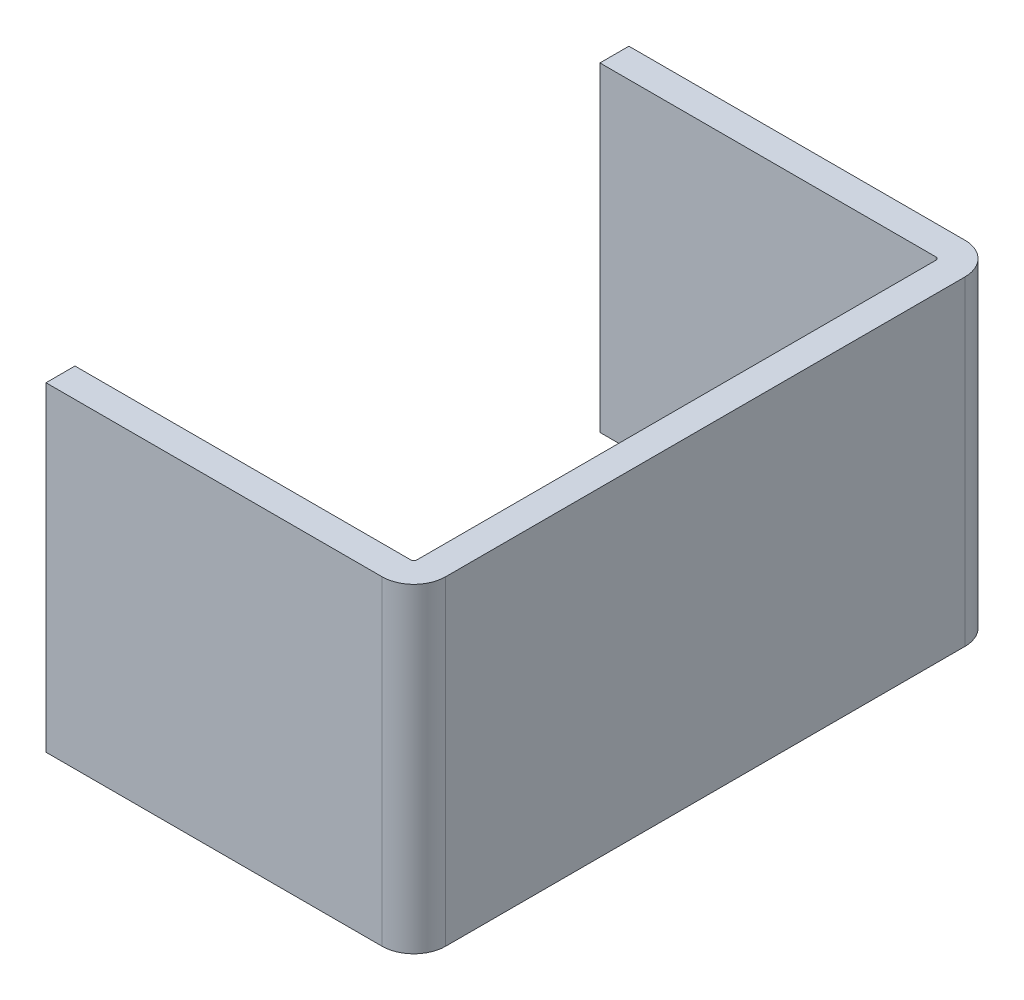
ISO-10303-21;
HEADER;
FILE_DESCRIPTION(('STEP AP214'),'2;1');
FILE_NAME('part.step','',(''),(''),'','','');
FILE_SCHEMA(('AUTOMOTIVE_DESIGN { 1 0 10303 214 1 1 1 1 }'));
ENDSEC;
DATA;
#1=APPLICATION_CONTEXT('core data for automotive mechanical design processes');
#2=APPLICATION_PROTOCOL_DEFINITION('international standard','automotive_design',2000,#1);
#3=PRODUCT_CONTEXT('',#1,'mechanical');
#4=PRODUCT('Part','Part','',(#3));
#5=PRODUCT_RELATED_PRODUCT_CATEGORY('part','',(#4));
#6=PRODUCT_DEFINITION_FORMATION('','',#4);
#7=PRODUCT_DEFINITION_CONTEXT('part definition',#1,'design');
#8=PRODUCT_DEFINITION('design','',#6,#7);
#9=PRODUCT_DEFINITION_SHAPE('','',#8);
#10=(LENGTH_UNIT() NAMED_UNIT(*) SI_UNIT(.MILLI.,.METRE.));
#11=(NAMED_UNIT(*) PLANE_ANGLE_UNIT() SI_UNIT($,.RADIAN.));
#12=(NAMED_UNIT(*) SI_UNIT($,.STERADIAN.) SOLID_ANGLE_UNIT());
#13=UNCERTAINTY_MEASURE_WITH_UNIT(LENGTH_MEASURE(1.E-05),#10,'distance_accuracy_value','');
#14=(GEOMETRIC_REPRESENTATION_CONTEXT(3) GLOBAL_UNCERTAINTY_ASSIGNED_CONTEXT((#13)) GLOBAL_UNIT_ASSIGNED_CONTEXT((#10,
#11,#12)) REPRESENTATION_CONTEXT('',''));
#15=CARTESIAN_POINT('',(0.,0.,0.));
#16=DIRECTION('',(0.,0.,1.));
#17=DIRECTION('',(1.,0.,0.));
#18=AXIS2_PLACEMENT_3D('',#15,#16,#17);
#19=CARTESIAN_POINT('',(0.,1.1049,4.025));
#20=DIRECTION('',(0.,0.,-1.));
#21=DIRECTION('',(-1.,0.,0.));
#22=AXIS2_PLACEMENT_3D('',#19,#20,#21);
#23=PLANE('',#22);
#24=DIRECTION('',(1.,0.,0.));
#25=VECTOR('',#24,1.);
#26=CARTESIAN_POINT('',(0.,1.1049,4.025));
#27=LINE('',#26,#25);
#28=CARTESIAN_POINT('',(2.32,1.1049,4.025));
#29=VERTEX_POINT('',#28);
#30=CARTESIAN_POINT('',(0.,1.1049,4.025));
#31=VERTEX_POINT('',#30);
#32=EDGE_CURVE('E187',#29,#31,#27,.F.);
#33=ORIENTED_EDGE('',*,*,#32,.T.);
#34=DIRECTION('',(0.,1.,0.));
#35=VECTOR('',#34,1.);
#36=CARTESIAN_POINT('',(0.,-1.1049,4.025));
#37=LINE('',#36,#35);
#38=CARTESIAN_POINT('',(0.,-1.1049,4.025));
#39=VERTEX_POINT('',#38);
#40=EDGE_CURVE('E184',#39,#31,#37,.T.);
#41=ORIENTED_EDGE('',*,*,#40,.F.);
#42=DIRECTION('',(1.,0.,0.));
#43=VECTOR('',#42,1.);
#44=CARTESIAN_POINT('',(0.,-1.1049,4.025));
#45=LINE('',#44,#43);
#46=CARTESIAN_POINT('',(2.32,-1.1049,4.025));
#47=VERTEX_POINT('',#46);
#48=EDGE_CURVE('E171',#39,#47,#45,.T.);
#49=ORIENTED_EDGE('',*,*,#48,.T.);
#50=DIRECTION('',(0.,1.,0.));
#51=VECTOR('',#50,1.);
#52=CARTESIAN_POINT('',(2.32,1.1049,4.025));
#53=LINE('',#52,#51);
#54=EDGE_CURVE('E98',#29,#47,#53,.F.);
#55=ORIENTED_EDGE('',*,*,#54,.F.);
#56=EDGE_LOOP('',(#33,#41,#49,#55));
#57=FACE_BOUND('',#56,.T.);
#58=ADVANCED_FACE('F17',(#57),#23,.F.);
#59=CARTESIAN_POINT('',(2.32,1.1049,0.));
#60=DIRECTION('',(0.,0.,1.));
#61=DIRECTION('',(1.,0.,0.));
#62=AXIS2_PLACEMENT_3D('',#59,#60,#61);
#63=PLANE('',#62);
#64=DIRECTION('',(1.,0.,0.));
#65=VECTOR('',#64,1.);
#66=CARTESIAN_POINT('',(2.32,1.1049,0.));
#67=LINE('',#66,#65);
#68=CARTESIAN_POINT('',(0.,1.1049,0.));
#69=VERTEX_POINT('',#68);
#70=CARTESIAN_POINT('',(2.32,1.1049,0.));
#71=VERTEX_POINT('',#70);
#72=EDGE_CURVE('E162',#69,#71,#67,.T.);
#73=ORIENTED_EDGE('',*,*,#72,.T.);
#74=DIRECTION('',(0.,1.,0.));
#75=VECTOR('',#74,1.);
#76=CARTESIAN_POINT('',(2.32,1.1049,0.));
#77=LINE('',#76,#75);
#78=CARTESIAN_POINT('',(2.32,-1.1049,0.));
#79=VERTEX_POINT('',#78);
#80=EDGE_CURVE('E97',#79,#71,#77,.T.);
#81=ORIENTED_EDGE('',*,*,#80,.F.);
#82=DIRECTION('',(1.,0.,0.));
#83=VECTOR('',#82,1.);
#84=CARTESIAN_POINT('',(2.32,-1.1049,0.));
#85=LINE('',#84,#83);
#86=CARTESIAN_POINT('',(0.,-1.1049,0.));
#87=VERTEX_POINT('',#86);
#88=EDGE_CURVE('E94',#79,#87,#85,.F.);
#89=ORIENTED_EDGE('',*,*,#88,.T.);
#90=DIRECTION('',(0.,1.,0.));
#91=VECTOR('',#90,1.);
#92=CARTESIAN_POINT('',(0.,-1.1049,0.));
#93=LINE('',#92,#91);
#94=EDGE_CURVE('E153',#87,#69,#93,.T.);
#95=ORIENTED_EDGE('',*,*,#94,.T.);
#96=EDGE_LOOP('',(#73,#81,#89,#95));
#97=FACE_BOUND('',#96,.T.);
#98=ADVANCED_FACE('F267',(#97),#63,.F.);
#99=CARTESIAN_POINT('',(0.,-1.1049,3.825));
#100=DIRECTION('',(-1.,0.,0.));
#101=DIRECTION('',(0.,0.,1.));
#102=AXIS2_PLACEMENT_3D('',#99,#100,#101);
#103=PLANE('',#102);
#104=DIRECTION('',(0.,0.,1.));
#105=VECTOR('',#104,1.);
#106=CARTESIAN_POINT('',(0.,1.1049,3.825));
#107=LINE('',#106,#105);
#108=CARTESIAN_POINT('',(0.,1.1049,3.825));
#109=VERTEX_POINT('',#108);
#110=EDGE_CURVE('E175',#31,#109,#107,.F.);
#111=ORIENTED_EDGE('',*,*,#110,.T.);
#112=DIRECTION('',(0.,1.,0.));
#113=VECTOR('',#112,1.);
#114=CARTESIAN_POINT('',(0.,-1.1049,3.825));
#115=LINE('',#114,#113);
#116=CARTESIAN_POINT('',(0.,-1.1049,3.825));
#117=VERTEX_POINT('',#116);
#118=EDGE_CURVE('E134',#109,#117,#115,.F.);
#119=ORIENTED_EDGE('',*,*,#118,.T.);
#120=DIRECTION('',(0.,0.,1.));
#121=VECTOR('',#120,1.);
#122=CARTESIAN_POINT('',(0.,-1.1049,4.025));
#123=LINE('',#122,#121);
#124=EDGE_CURVE('E172',#117,#39,#123,.T.);
#125=ORIENTED_EDGE('',*,*,#124,.T.);
#126=ORIENTED_EDGE('',*,*,#40,.T.);
#127=EDGE_LOOP('',(#111,#119,#125,#126));
#128=FACE_BOUND('',#127,.T.);
#129=ADVANCED_FACE('F225',(#128),#103,.T.);
#130=CARTESIAN_POINT('',(2.32,1.1049,3.805));
#131=DIRECTION('',(0.,1.,0.));
#132=DIRECTION('',(0.,0.,1.));
#133=AXIS2_PLACEMENT_3D('',#130,#131,#132);
#134=CYLINDRICAL_SURFACE('',#133,0.22);
#135=CARTESIAN_POINT('',(2.32,1.1049,3.805));
#136=DIRECTION('',(0.,1.,0.));
#137=DIRECTION('',(0.,0.,1.));
#138=AXIS2_PLACEMENT_3D('',#135,#136,#137);
#139=CIRCLE('',#138,0.22);
#140=CARTESIAN_POINT('',(2.54,1.1049,3.805));
#141=VERTEX_POINT('',#140);
#142=EDGE_CURVE('E140',#29,#141,#139,.T.);
#143=ORIENTED_EDGE('',*,*,#142,.F.);
#144=ORIENTED_EDGE('',*,*,#54,.T.);
#145=CARTESIAN_POINT('',(2.32,-1.1049,3.805));
#146=DIRECTION('',(0.,1.,0.));
#147=DIRECTION('',(0.,0.,1.));
#148=AXIS2_PLACEMENT_3D('',#145,#146,#147);
#149=CIRCLE('',#148,0.22);
#150=CARTESIAN_POINT('',(2.54,-1.1049,3.805));
#151=VERTEX_POINT('',#150);
#152=EDGE_CURVE('E125',#151,#47,#149,.F.);
#153=ORIENTED_EDGE('',*,*,#152,.F.);
#154=DIRECTION('',(0.,1.,0.));
#155=VECTOR('',#154,1.);
#156=CARTESIAN_POINT('',(2.54,1.1049,3.805));
#157=LINE('',#156,#155);
#158=EDGE_CURVE('E108',#151,#141,#157,.T.);
#159=ORIENTED_EDGE('',*,*,#158,.T.);
#160=EDGE_LOOP('',(#143,#144,#153,#159));
#161=FACE_BOUND('',#160,.T.);
#162=ADVANCED_FACE('F217',(#161),#134,.T.);
#163=CARTESIAN_POINT('',(2.32,1.1049,0.22));
#164=DIRECTION('',(0.,1.,0.));
#165=DIRECTION('',(0.,0.,1.));
#166=AXIS2_PLACEMENT_3D('',#163,#164,#165);
#167=CYLINDRICAL_SURFACE('',#166,0.22);
#168=CARTESIAN_POINT('',(2.32,1.1049,0.22));
#169=DIRECTION('',(0.,1.,0.));
#170=DIRECTION('',(0.,0.,1.));
#171=AXIS2_PLACEMENT_3D('',#168,#169,#170);
#172=CIRCLE('',#171,0.22);
#173=CARTESIAN_POINT('',(2.54,1.1049,0.22));
#174=VERTEX_POINT('',#173);
#175=EDGE_CURVE('E103',#71,#174,#172,.F.);
#176=ORIENTED_EDGE('',*,*,#175,.T.);
#177=DIRECTION('',(0.,1.,0.));
#178=VECTOR('',#177,1.);
#179=CARTESIAN_POINT('',(2.54,1.1049,0.22));
#180=LINE('',#179,#178);
#181=CARTESIAN_POINT('',(2.54,-1.1049,0.22));
#182=VERTEX_POINT('',#181);
#183=EDGE_CURVE('E100',#174,#182,#180,.F.);
#184=ORIENTED_EDGE('',*,*,#183,.T.);
#185=CARTESIAN_POINT('',(2.32,-1.1049,0.22));
#186=DIRECTION('',(0.,1.,0.));
#187=DIRECTION('',(0.,0.,1.));
#188=AXIS2_PLACEMENT_3D('',#185,#186,#187);
#189=CIRCLE('',#188,0.22);
#190=EDGE_CURVE('E20',#182,#79,#189,.T.);
#191=ORIENTED_EDGE('',*,*,#190,.T.);
#192=ORIENTED_EDGE('',*,*,#80,.T.);
#193=EDGE_LOOP('',(#176,#184,#191,#192));
#194=FACE_BOUND('',#193,.T.);
#195=ADVANCED_FACE('F101',(#194),#167,.T.);
#196=CARTESIAN_POINT('',(0.,-1.1049,0.2));
#197=DIRECTION('',(1.,0.,0.));
#198=DIRECTION('',(0.,0.,-1.));
#199=AXIS2_PLACEMENT_3D('',#196,#197,#198);
#200=PLANE('',#199);
#201=DIRECTION('',(0.,0.,-1.));
#202=VECTOR('',#201,1.);
#203=CARTESIAN_POINT('',(0.,1.1049,0.2));
#204=LINE('',#203,#202);
#205=CARTESIAN_POINT('',(0.,1.1049,0.2));
#206=VERTEX_POINT('',#205);
#207=EDGE_CURVE('E156',#69,#206,#204,.F.);
#208=ORIENTED_EDGE('',*,*,#207,.F.);
#209=ORIENTED_EDGE('',*,*,#94,.F.);
#210=DIRECTION('',(0.,0.,-1.));
#211=VECTOR('',#210,1.);
#212=CARTESIAN_POINT('',(0.,-1.1049,0.2));
#213=LINE('',#212,#211);
#214=CARTESIAN_POINT('',(0.,-1.1049,0.2));
#215=VERTEX_POINT('',#214);
#216=EDGE_CURVE('E151',#215,#87,#213,.T.);
#217=ORIENTED_EDGE('',*,*,#216,.F.);
#218=DIRECTION('',(0.,1.,0.));
#219=VECTOR('',#218,1.);
#220=CARTESIAN_POINT('',(0.,-1.1049,0.2));
#221=LINE('',#220,#219);
#222=EDGE_CURVE('E145',#215,#206,#221,.T.);
#223=ORIENTED_EDGE('',*,*,#222,.T.);
#224=EDGE_LOOP('',(#208,#209,#217,#223));
#225=FACE_BOUND('',#224,.T.);
#226=ADVANCED_FACE('F266',(#225),#200,.F.);
#227=CARTESIAN_POINT('',(0.,-1.1049,3.825));
#228=DIRECTION('',(0.,0.,1.));
#229=DIRECTION('',(1.,0.,0.));
#230=AXIS2_PLACEMENT_3D('',#227,#228,#229);
#231=PLANE('',#230);
#232=DIRECTION('',(1.,0.,0.));
#233=VECTOR('',#232,1.);
#234=CARTESIAN_POINT('',(0.,-1.1049,3.825));
#235=LINE('',#234,#233);
#236=CARTESIAN_POINT('',(2.32,-1.1049,3.825));
#237=VERTEX_POINT('',#236);
#238=EDGE_CURVE('E132',#117,#237,#235,.T.);
#239=ORIENTED_EDGE('',*,*,#238,.F.);
#240=ORIENTED_EDGE('',*,*,#118,.F.);
#241=DIRECTION('',(1.,0.,0.));
#242=VECTOR('',#241,1.);
#243=CARTESIAN_POINT('',(0.,1.1049,3.825));
#244=LINE('',#243,#242);
#245=CARTESIAN_POINT('',(2.32,1.1049,3.825));
#246=VERTEX_POINT('',#245);
#247=EDGE_CURVE('E137',#246,#109,#244,.F.);
#248=ORIENTED_EDGE('',*,*,#247,.F.);
#249=DIRECTION('',(0.,1.,0.));
#250=VECTOR('',#249,1.);
#251=CARTESIAN_POINT('',(2.32,-1.1049,3.825));
#252=LINE('',#251,#250);
#253=EDGE_CURVE('E118',#246,#237,#252,.F.);
#254=ORIENTED_EDGE('',*,*,#253,.T.);
#255=EDGE_LOOP('',(#239,#240,#248,#254));
#256=FACE_BOUND('',#255,.T.);
#257=ADVANCED_FACE('F230',(#256),#231,.F.);
#258=CARTESIAN_POINT('',(2.54,1.1049,3.805));
#259=DIRECTION('',(-1.,0.,0.));
#260=DIRECTION('',(0.,0.,1.));
#261=AXIS2_PLACEMENT_3D('',#258,#259,#260);
#262=PLANE('',#261);
#263=DIRECTION('',(0.,0.,-1.));
#264=VECTOR('',#263,1.);
#265=CARTESIAN_POINT('',(2.54,1.1049,3.805));
#266=LINE('',#265,#264);
#267=EDGE_CURVE('E143',#174,#141,#266,.F.);
#268=ORIENTED_EDGE('',*,*,#267,.T.);
#269=ORIENTED_EDGE('',*,*,#158,.F.);
#270=DIRECTION('',(0.,0.,1.));
#271=VECTOR('',#270,1.);
#272=CARTESIAN_POINT('',(2.54,-1.1049,3.805));
#273=LINE('',#272,#271);
#274=EDGE_CURVE('E91',#151,#182,#273,.F.);
#275=ORIENTED_EDGE('',*,*,#274,.T.);
#276=ORIENTED_EDGE('',*,*,#183,.F.);
#277=EDGE_LOOP('',(#268,#269,#275,#276));
#278=FACE_BOUND('',#277,.T.);
#279=ADVANCED_FACE('F110',(#278),#262,.F.);
#280=CARTESIAN_POINT('',(2.32,-1.1049,0.2));
#281=DIRECTION('',(0.,0.,-1.));
#282=DIRECTION('',(-1.,0.,0.));
#283=AXIS2_PLACEMENT_3D('',#280,#281,#282);
#284=PLANE('',#283);
#285=DIRECTION('',(-1.,0.,0.));
#286=VECTOR('',#285,1.);
#287=CARTESIAN_POINT('',(2.32,-1.1049,0.2));
#288=LINE('',#287,#286);
#289=CARTESIAN_POINT('',(2.32,-1.1049,0.2));
#290=VERTEX_POINT('',#289);
#291=EDGE_CURVE('E148',#290,#215,#288,.T.);
#292=ORIENTED_EDGE('',*,*,#291,.F.);
#293=DIRECTION('',(0.,1.,0.));
#294=VECTOR('',#293,1.);
#295=CARTESIAN_POINT('',(2.32,-1.1049,0.2));
#296=LINE('',#295,#294);
#297=CARTESIAN_POINT('',(2.32,1.1049,0.2));
#298=VERTEX_POINT('',#297);
#299=EDGE_CURVE('E205',#290,#298,#296,.T.);
#300=ORIENTED_EDGE('',*,*,#299,.T.);
#301=DIRECTION('',(-1.,0.,0.));
#302=VECTOR('',#301,1.);
#303=CARTESIAN_POINT('',(2.32,1.1049,0.2));
#304=LINE('',#303,#302);
#305=EDGE_CURVE('E107',#206,#298,#304,.F.);
#306=ORIENTED_EDGE('',*,*,#305,.F.);
#307=ORIENTED_EDGE('',*,*,#222,.F.);
#308=EDGE_LOOP('',(#292,#300,#306,#307));
#309=FACE_BOUND('',#308,.T.);
#310=ADVANCED_FACE('F256',(#309),#284,.F.);
#311=CARTESIAN_POINT('',(2.34,1.1049,3.805));
#312=DIRECTION('',(0.,-1.,0.));
#313=DIRECTION('',(0.,0.,-1.));
#314=AXIS2_PLACEMENT_3D('',#311,#312,#313);
#315=PLANE('',#314);
#316=DIRECTION('',(0.,0.,-1.));
#317=VECTOR('',#316,1.);
#318=CARTESIAN_POINT('',(2.34,1.1049,3.805));
#319=LINE('',#318,#317);
#320=CARTESIAN_POINT('',(2.34,1.1049,0.22));
#321=VERTEX_POINT('',#320);
#322=CARTESIAN_POINT('',(2.34,1.1049,3.805));
#323=VERTEX_POINT('',#322);
#324=EDGE_CURVE('E121',#321,#323,#319,.F.);
#325=ORIENTED_EDGE('',*,*,#324,.T.);
#326=CARTESIAN_POINT('',(2.32,1.1049,3.805));
#327=DIRECTION('',(0.,1.,0.));
#328=DIRECTION('',(0.,0.,1.));
#329=AXIS2_PLACEMENT_3D('',#326,#327,#328);
#330=CIRCLE('',#329,0.02);
#331=EDGE_CURVE('E131',#323,#246,#330,.F.);
#332=ORIENTED_EDGE('',*,*,#331,.T.);
#333=ORIENTED_EDGE('',*,*,#247,.T.);
#334=ORIENTED_EDGE('',*,*,#110,.F.);
#335=ORIENTED_EDGE('',*,*,#32,.F.);
#336=ORIENTED_EDGE('',*,*,#142,.T.);
#337=ORIENTED_EDGE('',*,*,#267,.F.);
#338=ORIENTED_EDGE('',*,*,#175,.F.);
#339=ORIENTED_EDGE('',*,*,#72,.F.);
#340=ORIENTED_EDGE('',*,*,#207,.T.);
#341=ORIENTED_EDGE('',*,*,#305,.T.);
#342=CARTESIAN_POINT('',(2.32,1.1049,0.22));
#343=DIRECTION('',(0.,1.,0.));
#344=DIRECTION('',(0.,0.,1.));
#345=AXIS2_PLACEMENT_3D('',#342,#343,#344);
#346=CIRCLE('',#345,0.02);
#347=EDGE_CURVE('E113',#298,#321,#346,.F.);
#348=ORIENTED_EDGE('',*,*,#347,.T.);
#349=EDGE_LOOP('',(#325,#332,#333,#334,#335,#336,#337,#338,#339,#340,#341,#348));
#350=FACE_BOUND('',#349,.T.);
#351=ADVANCED_FACE('F213',(#350),#315,.F.);
#352=CARTESIAN_POINT('',(2.32,-1.1049,3.805));
#353=DIRECTION('',(0.,1.,0.));
#354=DIRECTION('',(0.,0.,1.));
#355=AXIS2_PLACEMENT_3D('',#352,#353,#354);
#356=CYLINDRICAL_SURFACE('',#355,0.02);
#357=CARTESIAN_POINT('',(2.32,-1.1049,3.805));
#358=DIRECTION('',(0.,1.,0.));
#359=DIRECTION('',(0.,0.,1.));
#360=AXIS2_PLACEMENT_3D('',#357,#358,#359);
#361=CIRCLE('',#360,0.02);
#362=CARTESIAN_POINT('',(2.34,-1.1049,3.805));
#363=VERTEX_POINT('',#362);
#364=EDGE_CURVE('E114',#237,#363,#361,.T.);
#365=ORIENTED_EDGE('',*,*,#364,.F.);
#366=ORIENTED_EDGE('',*,*,#253,.F.);
#367=ORIENTED_EDGE('',*,*,#331,.F.);
#368=DIRECTION('',(0.,1.,0.));
#369=VECTOR('',#368,1.);
#370=CARTESIAN_POINT('',(2.34,-1.1049,3.805));
#371=LINE('',#370,#369);
#372=EDGE_CURVE('E126',#323,#363,#371,.F.);
#373=ORIENTED_EDGE('',*,*,#372,.T.);
#374=EDGE_LOOP('',(#365,#366,#367,#373));
#375=FACE_BOUND('',#374,.T.);
#376=ADVANCED_FACE('F236',(#375),#356,.F.);
#377=CARTESIAN_POINT('',(2.54,-1.1049,3.805));
#378=DIRECTION('',(0.,1.,0.));
#379=DIRECTION('',(0.,0.,1.));
#380=AXIS2_PLACEMENT_3D('',#377,#378,#379);
#381=PLANE('',#380);
#382=ORIENTED_EDGE('',*,*,#274,.F.);
#383=ORIENTED_EDGE('',*,*,#152,.T.);
#384=ORIENTED_EDGE('',*,*,#48,.F.);
#385=ORIENTED_EDGE('',*,*,#124,.F.);
#386=ORIENTED_EDGE('',*,*,#238,.T.);
#387=ORIENTED_EDGE('',*,*,#364,.T.);
#388=DIRECTION('',(0.,0.,-1.));
#389=VECTOR('',#388,1.);
#390=CARTESIAN_POINT('',(2.34,-1.1049,3.805));
#391=LINE('',#390,#389);
#392=CARTESIAN_POINT('',(2.34,-1.1049,0.22));
#393=VERTEX_POINT('',#392);
#394=EDGE_CURVE('E26',#363,#393,#391,.T.);
#395=ORIENTED_EDGE('',*,*,#394,.T.);
#396=CARTESIAN_POINT('',(2.32,-1.1049,0.22));
#397=DIRECTION('',(0.,1.,0.));
#398=DIRECTION('',(0.,0.,1.));
#399=AXIS2_PLACEMENT_3D('',#396,#397,#398);
#400=CIRCLE('',#399,0.02);
#401=EDGE_CURVE('E34',#393,#290,#400,.T.);
#402=ORIENTED_EDGE('',*,*,#401,.T.);
#403=ORIENTED_EDGE('',*,*,#291,.T.);
#404=ORIENTED_EDGE('',*,*,#216,.T.);
#405=ORIENTED_EDGE('',*,*,#88,.F.);
#406=ORIENTED_EDGE('',*,*,#190,.F.);
#407=EDGE_LOOP('',(#382,#383,#384,#385,#386,#387,#395,#402,#403,#404,#405,#406));
#408=FACE_BOUND('',#407,.T.);
#409=ADVANCED_FACE('F89',(#408),#381,.F.);
#410=CARTESIAN_POINT('',(2.32,-1.1049,0.22));
#411=DIRECTION('',(0.,1.,0.));
#412=DIRECTION('',(0.,0.,1.));
#413=AXIS2_PLACEMENT_3D('',#410,#411,#412);
#414=CYLINDRICAL_SURFACE('',#413,0.02);
#415=ORIENTED_EDGE('',*,*,#401,.F.);
#416=DIRECTION('',(0.,1.,0.));
#417=VECTOR('',#416,1.);
#418=CARTESIAN_POINT('',(2.34,-1.1049,0.22));
#419=LINE('',#418,#417);
#420=EDGE_CURVE('E11',#393,#321,#419,.T.);
#421=ORIENTED_EDGE('',*,*,#420,.T.);
#422=ORIENTED_EDGE('',*,*,#347,.F.);
#423=ORIENTED_EDGE('',*,*,#299,.F.);
#424=EDGE_LOOP('',(#415,#421,#422,#423));
#425=FACE_BOUND('',#424,.T.);
#426=ADVANCED_FACE('F257',(#425),#414,.F.);
#427=CARTESIAN_POINT('',(2.34,-1.1049,3.805));
#428=DIRECTION('',(1.,0.,0.));
#429=DIRECTION('',(0.,0.,-1.));
#430=AXIS2_PLACEMENT_3D('',#427,#428,#429);
#431=PLANE('',#430);
#432=ORIENTED_EDGE('',*,*,#394,.F.);
#433=ORIENTED_EDGE('',*,*,#372,.F.);
#434=ORIENTED_EDGE('',*,*,#324,.F.);
#435=ORIENTED_EDGE('',*,*,#420,.F.);
#436=EDGE_LOOP('',(#432,#433,#434,#435));
#437=FACE_BOUND('',#436,.T.);
#438=ADVANCED_FACE('F239',(#437),#431,.F.);
#439=CLOSED_SHELL('',(#58,#98,#129,#162,#195,#226,#257,#279,#310,#351,#376,#409,#426,#438));
#440=MANIFOLD_SOLID_BREP('B1',#439);
#441=ADVANCED_BREP_SHAPE_REPRESENTATION('',(#18,#440),#14);
#442=SHAPE_DEFINITION_REPRESENTATION(#9,#441);
ENDSEC;
END-ISO-10303-21;
